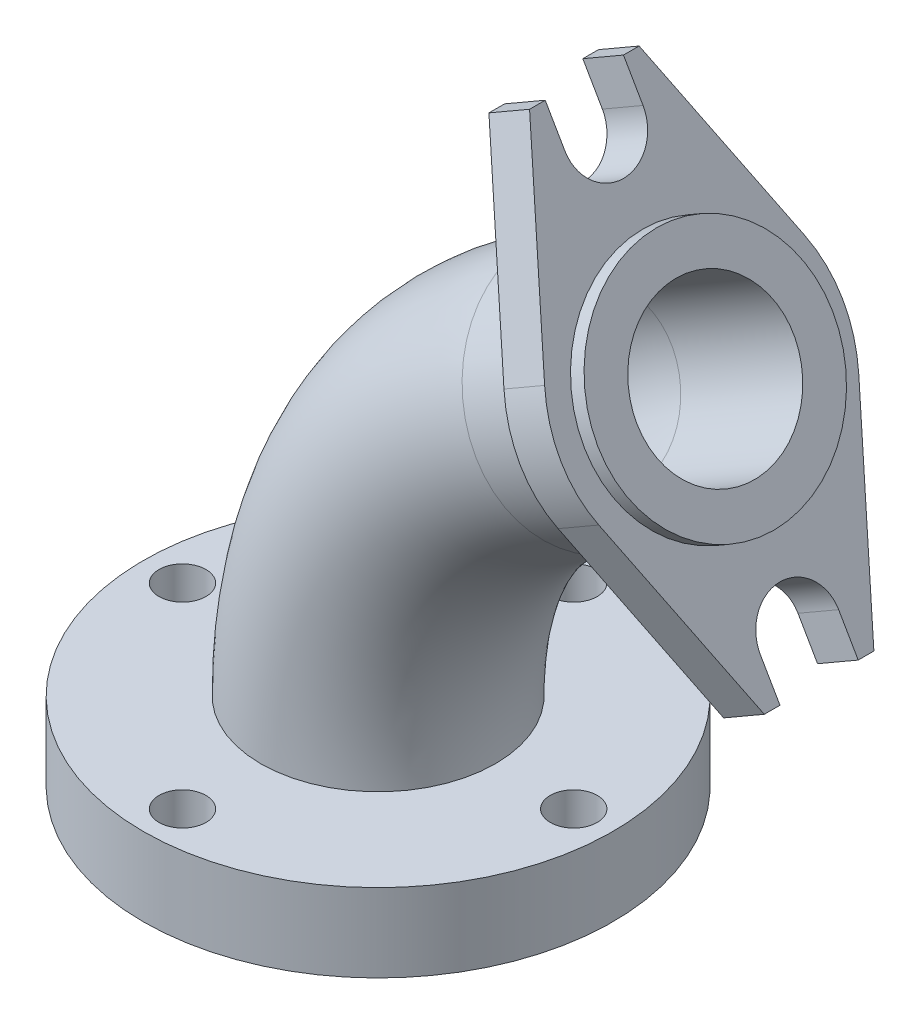
ISO-10303-21;
HEADER;
FILE_DESCRIPTION(('STEP AP214'),'2;1');
FILE_NAME('part.step','',(''),(''),'','','');
FILE_SCHEMA(('AUTOMOTIVE_DESIGN { 1 0 10303 214 1 1 1 1 }'));
ENDSEC;
DATA;
#1=APPLICATION_CONTEXT('core data for automotive mechanical design processes');
#2=APPLICATION_PROTOCOL_DEFINITION('international standard','automotive_design',2000,#1);
#3=PRODUCT_CONTEXT('',#1,'mechanical');
#4=PRODUCT('Part','Part','',(#3));
#5=PRODUCT_RELATED_PRODUCT_CATEGORY('part','',(#4));
#6=PRODUCT_DEFINITION_FORMATION('','',#4);
#7=PRODUCT_DEFINITION_CONTEXT('part definition',#1,'design');
#8=PRODUCT_DEFINITION('design','',#6,#7);
#9=PRODUCT_DEFINITION_SHAPE('','',#8);
#10=(LENGTH_UNIT() NAMED_UNIT(*) SI_UNIT(.MILLI.,.METRE.));
#11=(NAMED_UNIT(*) PLANE_ANGLE_UNIT() SI_UNIT($,.RADIAN.));
#12=(NAMED_UNIT(*) SI_UNIT($,.STERADIAN.) SOLID_ANGLE_UNIT());
#13=UNCERTAINTY_MEASURE_WITH_UNIT(LENGTH_MEASURE(1.E-05),#10,'distance_accuracy_value','');
#14=(GEOMETRIC_REPRESENTATION_CONTEXT(3) GLOBAL_UNCERTAINTY_ASSIGNED_CONTEXT((#13)) GLOBAL_UNIT_ASSIGNED_CONTEXT((#10,
#11,#12)) REPRESENTATION_CONTEXT('',''));
#15=CARTESIAN_POINT('',(0.,0.,0.));
#16=DIRECTION('',(0.,0.,1.));
#17=DIRECTION('',(1.,0.,0.));
#18=AXIS2_PLACEMENT_3D('',#15,#16,#17);
#19=CARTESIAN_POINT('',(27.4999999999998,57.631397208144,0.));
#20=DIRECTION('',(0.866025403784436,0.500000000000004,0.));
#21=DIRECTION('',(-0.500000000000004,0.866025403784436,0.));
#22=AXIS2_PLACEMENT_3D('',#19,#20,#21);
#23=CYLINDRICAL_SURFACE('',#22,15.);
#24=CARTESIAN_POINT('',(27.4999999999998,57.631397208144,0.));
#25=DIRECTION('',(0.866025403784436,0.500000000000004,0.));
#26=DIRECTION('',(0.,0.,1.));
#27=AXIS2_PLACEMENT_3D('',#24,#25,#26);
#28=CIRCLE('',#27,15.);
#29=CARTESIAN_POINT('',(19.9999999999997,70.6217782649105,0.));
#30=VERTEX_POINT('',#29);
#31=EDGE_CURVE('E306',#30,#30,#28,.T.);
#32=ORIENTED_EDGE('',*,*,#31,.T.);
#33=EDGE_LOOP('',(#32));
#34=FACE_BOUND('',#33,.T.);
#35=CARTESIAN_POINT('',(36.1602540378442,62.6313972081441,0.));
#36=DIRECTION('',(0.866025403784436,0.500000000000004,0.));
#37=DIRECTION('',(-0.500000000000005,0.866025403784436,0.));
#38=AXIS2_PLACEMENT_3D('',#35,#36,#37);
#39=CIRCLE('',#38,15.);
#40=CARTESIAN_POINT('',(28.6602540378441,75.6217782649106,0.));
#41=VERTEX_POINT('',#40);
#42=EDGE_CURVE('E263',#41,#41,#39,.F.);
#43=ORIENTED_EDGE('',*,*,#42,.T.);
#44=EDGE_LOOP('',(#43));
#45=FACE_BOUND('',#44,.T.);
#46=ADVANCED_FACE('F43',(#34,#45),#23,.T.);
#47=CARTESIAN_POINT('',(0.,10.,0.));
#48=DIRECTION('',(0.,1.,0.));
#49=DIRECTION('',(0.,0.,1.));
#50=AXIS2_PLACEMENT_3D('',#47,#48,#49);
#51=PLANE('',#50);
#52=CARTESIAN_POINT('',(0.,10.,0.));
#53=DIRECTION('',(0.,1.,0.));
#54=DIRECTION('',(0.,0.,1.));
#55=AXIS2_PLACEMENT_3D('',#52,#53,#54);
#56=CIRCLE('',#55,15.);
#57=CARTESIAN_POINT('',(-15.,10.,0.));
#58=VERTEX_POINT('',#57);
#59=EDGE_CURVE('E54',#58,#58,#56,.T.);
#60=ORIENTED_EDGE('',*,*,#59,.F.);
#61=EDGE_LOOP('',(#60));
#62=FACE_BOUND('',#61,.T.);
#63=CARTESIAN_POINT('',(-25.,10.,-1.74574066942157E-13));
#64=DIRECTION('',(0.,1.,0.));
#65=DIRECTION('',(0.,0.,1.));
#66=AXIS2_PLACEMENT_3D('',#63,#64,#65);
#67=CIRCLE('',#66,3.);
#68=CARTESIAN_POINT('',(-25.,10.,2.99999999999983));
#69=VERTEX_POINT('',#68);
#70=EDGE_CURVE('E339',#69,#69,#67,.T.);
#71=ORIENTED_EDGE('',*,*,#70,.F.);
#72=EDGE_LOOP('',(#71));
#73=FACE_BOUND('',#72,.T.);
#74=CARTESIAN_POINT('',(25.,10.,0.));
#75=DIRECTION('',(0.,1.,0.));
#76=DIRECTION('',(0.,0.,1.));
#77=AXIS2_PLACEMENT_3D('',#74,#75,#76);
#78=CIRCLE('',#77,3.);
#79=CARTESIAN_POINT('',(25.,10.,3.));
#80=VERTEX_POINT('',#79);
#81=EDGE_CURVE('E355',#80,#80,#78,.T.);
#82=ORIENTED_EDGE('',*,*,#81,.F.);
#83=EDGE_LOOP('',(#82));
#84=FACE_BOUND('',#83,.T.);
#85=CARTESIAN_POINT('',(0.,10.,0.));
#86=DIRECTION('',(0.,1.,0.));
#87=DIRECTION('',(0.,0.,1.));
#88=AXIS2_PLACEMENT_3D('',#85,#86,#87);
#89=CIRCLE('',#88,30.);
#90=CARTESIAN_POINT('',(0.,10.,30.));
#91=VERTEX_POINT('',#90);
#92=EDGE_CURVE('E327',#91,#91,#89,.T.);
#93=ORIENTED_EDGE('',*,*,#92,.T.);
#94=EDGE_LOOP('',(#93));
#95=FACE_BOUND('',#94,.T.);
#96=CARTESIAN_POINT('',(0.,10.,25.));
#97=DIRECTION('',(0.,1.,0.));
#98=DIRECTION('',(0.,0.,1.));
#99=AXIS2_PLACEMENT_3D('',#96,#97,#98);
#100=CIRCLE('',#99,3.);
#101=CARTESIAN_POINT('',(0.,10.,28.));
#102=VERTEX_POINT('',#101);
#103=EDGE_CURVE('E347',#102,#102,#100,.T.);
#104=ORIENTED_EDGE('',*,*,#103,.F.);
#105=EDGE_LOOP('',(#104));
#106=FACE_BOUND('',#105,.T.);
#107=CARTESIAN_POINT('',(2.61861100413235E-13,10.,-25.));
#108=DIRECTION('',(0.,1.,0.));
#109=DIRECTION('',(0.,0.,1.));
#110=AXIS2_PLACEMENT_3D('',#107,#108,#109);
#111=CIRCLE('',#110,3.);
#112=CARTESIAN_POINT('',(2.61861100413235E-13,10.,-22.));
#113=VERTEX_POINT('',#112);
#114=EDGE_CURVE('E331',#113,#113,#111,.T.);
#115=ORIENTED_EDGE('',*,*,#114,.F.);
#116=EDGE_LOOP('',(#115));
#117=FACE_BOUND('',#116,.T.);
#118=ADVANCED_FACE('F377',(#62,#73,#84,#95,#106,#117),#51,.T.);
#119=CARTESIAN_POINT('',(0.,0.,0.));
#120=DIRECTION('',(0.,1.,0.));
#121=DIRECTION('',(0.,0.,1.));
#122=AXIS2_PLACEMENT_3D('',#119,#120,#121);
#123=PLANE('',#122);
#124=CARTESIAN_POINT('',(0.,0.,0.));
#125=DIRECTION('',(0.,1.,0.));
#126=DIRECTION('',(0.,0.,1.));
#127=AXIS2_PLACEMENT_3D('',#124,#125,#126);
#128=CIRCLE('',#127,30.);
#129=CARTESIAN_POINT('',(0.,0.,30.));
#130=VERTEX_POINT('',#129);
#131=EDGE_CURVE('E47',#130,#130,#128,.T.);
#132=ORIENTED_EDGE('',*,*,#131,.F.);
#133=EDGE_LOOP('',(#132));
#134=FACE_BOUND('',#133,.T.);
#135=CARTESIAN_POINT('',(0.,0.,0.));
#136=DIRECTION('',(0.,1.,0.));
#137=DIRECTION('',(0.,0.,1.));
#138=AXIS2_PLACEMENT_3D('',#135,#136,#137);
#139=CIRCLE('',#138,10.);
#140=CARTESIAN_POINT('',(0.,0.,10.));
#141=VERTEX_POINT('',#140);
#142=EDGE_CURVE('E359',#141,#141,#139,.T.);
#143=ORIENTED_EDGE('',*,*,#142,.T.);
#144=EDGE_LOOP('',(#143));
#145=FACE_BOUND('',#144,.T.);
#146=CARTESIAN_POINT('',(25.,0.,0.));
#147=DIRECTION('',(0.,1.,0.));
#148=DIRECTION('',(0.,0.,1.));
#149=AXIS2_PLACEMENT_3D('',#146,#147,#148);
#150=CIRCLE('',#149,3.);
#151=CARTESIAN_POINT('',(25.,0.,3.));
#152=VERTEX_POINT('',#151);
#153=EDGE_CURVE('E351',#152,#152,#150,.T.);
#154=ORIENTED_EDGE('',*,*,#153,.T.);
#155=EDGE_LOOP('',(#154));
#156=FACE_BOUND('',#155,.T.);
#157=CARTESIAN_POINT('',(0.,0.,25.));
#158=DIRECTION('',(0.,1.,0.));
#159=DIRECTION('',(0.,0.,1.));
#160=AXIS2_PLACEMENT_3D('',#157,#158,#159);
#161=CIRCLE('',#160,3.);
#162=CARTESIAN_POINT('',(0.,0.,28.));
#163=VERTEX_POINT('',#162);
#164=EDGE_CURVE('E343',#163,#163,#161,.T.);
#165=ORIENTED_EDGE('',*,*,#164,.T.);
#166=EDGE_LOOP('',(#165));
#167=FACE_BOUND('',#166,.T.);
#168=CARTESIAN_POINT('',(-25.,0.,-1.74574066942157E-13));
#169=DIRECTION('',(0.,1.,0.));
#170=DIRECTION('',(0.,0.,1.));
#171=AXIS2_PLACEMENT_3D('',#168,#169,#170);
#172=CIRCLE('',#171,3.);
#173=CARTESIAN_POINT('',(-25.,0.,2.99999999999983));
#174=VERTEX_POINT('',#173);
#175=EDGE_CURVE('E335',#174,#174,#172,.T.);
#176=ORIENTED_EDGE('',*,*,#175,.T.);
#177=EDGE_LOOP('',(#176));
#178=FACE_BOUND('',#177,.T.);
#179=CARTESIAN_POINT('',(2.61861100413235E-13,0.,-25.));
#180=DIRECTION('',(0.,1.,0.));
#181=DIRECTION('',(0.,0.,1.));
#182=AXIS2_PLACEMENT_3D('',#179,#180,#181);
#183=CIRCLE('',#182,3.);
#184=CARTESIAN_POINT('',(2.61861100413235E-13,0.,-22.));
#185=VERTEX_POINT('',#184);
#186=EDGE_CURVE('E320',#185,#185,#183,.T.);
#187=ORIENTED_EDGE('',*,*,#186,.T.);
#188=EDGE_LOOP('',(#187));
#189=FACE_BOUND('',#188,.T.);
#190=ADVANCED_FACE('F374',(#134,#145,#156,#167,#178,#189),#123,.F.);
#191=CARTESIAN_POINT('',(0.,10.,0.));
#192=DIRECTION('',(0.,-1.,0.));
#193=DIRECTION('',(0.,0.,-1.));
#194=AXIS2_PLACEMENT_3D('',#191,#192,#193);
#195=CYLINDRICAL_SURFACE('',#194,30.);
#196=ORIENTED_EDGE('',*,*,#92,.F.);
#197=EDGE_LOOP('',(#196));
#198=FACE_BOUND('',#197,.T.);
#199=ORIENTED_EDGE('',*,*,#131,.T.);
#200=EDGE_LOOP('',(#199));
#201=FACE_BOUND('',#200,.T.);
#202=ADVANCED_FACE('F45',(#198,#201),#195,.T.);
#203=CARTESIAN_POINT('',(0.,10.,0.));
#204=DIRECTION('',(0.,-1.,0.));
#205=DIRECTION('',(0.,0.,-1.));
#206=AXIS2_PLACEMENT_3D('',#203,#204,#205);
#207=CYLINDRICAL_SURFACE('',#206,10.);
#208=CARTESIAN_POINT('',(0.,10.,0.));
#209=DIRECTION('',(0.,1.,0.));
#210=DIRECTION('',(0.,0.,1.));
#211=AXIS2_PLACEMENT_3D('',#208,#209,#210);
#212=CIRCLE('',#211,10.);
#213=CARTESIAN_POINT('',(-10.,10.,0.));
#214=VERTEX_POINT('',#213);
#215=EDGE_CURVE('E307',#214,#214,#212,.F.);
#216=ORIENTED_EDGE('',*,*,#215,.F.);
#217=EDGE_LOOP('',(#216));
#218=FACE_BOUND('',#217,.T.);
#219=ORIENTED_EDGE('',*,*,#142,.F.);
#220=EDGE_LOOP('',(#219));
#221=FACE_BOUND('',#220,.T.);
#222=ADVANCED_FACE('F568',(#218,#221),#207,.F.);
#223=CARTESIAN_POINT('',(25.,10.,0.));
#224=DIRECTION('',(0.,-1.,0.));
#225=DIRECTION('',(0.,0.,-1.));
#226=AXIS2_PLACEMENT_3D('',#223,#224,#225);
#227=CYLINDRICAL_SURFACE('',#226,3.);
#228=ORIENTED_EDGE('',*,*,#81,.T.);
#229=EDGE_LOOP('',(#228));
#230=FACE_BOUND('',#229,.T.);
#231=ORIENTED_EDGE('',*,*,#153,.F.);
#232=EDGE_LOOP('',(#231));
#233=FACE_BOUND('',#232,.T.);
#234=ADVANCED_FACE('F571',(#230,#233),#227,.F.);
#235=CARTESIAN_POINT('',(0.,10.,25.));
#236=DIRECTION('',(0.,-1.,0.));
#237=DIRECTION('',(0.,0.,-1.));
#238=AXIS2_PLACEMENT_3D('',#235,#236,#237);
#239=CYLINDRICAL_SURFACE('',#238,3.);
#240=ORIENTED_EDGE('',*,*,#103,.T.);
#241=EDGE_LOOP('',(#240));
#242=FACE_BOUND('',#241,.T.);
#243=ORIENTED_EDGE('',*,*,#164,.F.);
#244=EDGE_LOOP('',(#243));
#245=FACE_BOUND('',#244,.T.);
#246=ADVANCED_FACE('F403',(#242,#245),#239,.F.);
#247=CARTESIAN_POINT('',(-25.,10.,-1.74574066942157E-13));
#248=DIRECTION('',(0.,-1.,0.));
#249=DIRECTION('',(0.,0.,-1.));
#250=AXIS2_PLACEMENT_3D('',#247,#248,#249);
#251=CYLINDRICAL_SURFACE('',#250,3.);
#252=ORIENTED_EDGE('',*,*,#70,.T.);
#253=EDGE_LOOP('',(#252));
#254=FACE_BOUND('',#253,.T.);
#255=ORIENTED_EDGE('',*,*,#175,.F.);
#256=EDGE_LOOP('',(#255));
#257=FACE_BOUND('',#256,.T.);
#258=ADVANCED_FACE('F391',(#254,#257),#251,.F.);
#259=CARTESIAN_POINT('',(2.61861100413235E-13,10.,-25.));
#260=DIRECTION('',(0.,-1.,0.));
#261=DIRECTION('',(0.,0.,-1.));
#262=AXIS2_PLACEMENT_3D('',#259,#260,#261);
#263=CYLINDRICAL_SURFACE('',#262,3.);
#264=ORIENTED_EDGE('',*,*,#114,.T.);
#265=EDGE_LOOP('',(#264));
#266=FACE_BOUND('',#265,.T.);
#267=ORIENTED_EDGE('',*,*,#186,.F.);
#268=EDGE_LOOP('',(#267));
#269=FACE_BOUND('',#268,.T.);
#270=ADVANCED_FACE('F388',(#266,#269),#263,.F.);
#271=CARTESIAN_POINT('',(55.,10.,0.));
#272=DIRECTION('',(0.,0.,-1.));
#273=DIRECTION('',(-1.,0.,0.));
#274=AXIS2_PLACEMENT_3D('',#271,#272,#273);
#275=TOROIDAL_SURFACE('',#274,55.,15.);
#276=CARTESIAN_POINT('',(55.,10.,0.));
#277=DIRECTION('',(0.,0.,-1.));
#278=DIRECTION('',(-1.,0.,0.));
#279=AXIS2_PLACEMENT_3D('',#276,#277,#278);
#280=CIRCLE('',#279,70.);
#281=EDGE_CURVE('',#58,#30,#280,.T.);
#282=ORIENTED_EDGE('',*,*,#59,.T.);
#283=ORIENTED_EDGE('',*,*,#31,.F.);
#284=ORIENTED_EDGE('',*,*,#281,.T.);
#285=ORIENTED_EDGE('',*,*,#281,.F.);
#286=EDGE_LOOP('',(#282,#284,#283,#285));
#287=FACE_BOUND('',#286,.T.);
#288=ADVANCED_FACE('F390',(#287),#275,.T.);
#289=CARTESIAN_POINT('',(41.3564064605508,65.6313972081441,0.));
#290=DIRECTION('',(0.866025403784436,0.500000000000004,0.));
#291=DIRECTION('',(-0.500000000000005,0.866025403784436,0.));
#292=AXIS2_PLACEMENT_3D('',#289,#290,#291);
#293=CIRCLE('',#292,15.);
#294=CARTESIAN_POINT('',(33.8564064605507,78.6217782649106,0.));
#295=VERTEX_POINT('',#294);
#296=EDGE_CURVE('E11',#295,#295,#293,.F.);
#297=CARTESIAN_POINT('',(43.0884572681196,66.6313972081441,0.));
#298=DIRECTION('',(0.866025403784436,0.500000000000004,0.));
#299=DIRECTION('',(0.,0.,1.));
#300=AXIS2_PLACEMENT_3D('',#297,#298,#299);
#301=CIRCLE('',#300,15.);
#302=CARTESIAN_POINT('',(35.5884572681195,79.6217782649106,0.));
#303=VERTEX_POINT('',#302);
#304=EDGE_CURVE('E312',#303,#303,#301,.T.);
#305=CARTESIAN_POINT('',(33.8564064605507,78.6217782649106,0.));
#306=CARTESIAN_POINT('',(33.8744486564629,78.6321949315773,0.));
#307=CARTESIAN_POINT('',(33.8924908523751,78.642611598244,0.));
#308=CARTESIAN_POINT('',(33.9285752441994,78.6634449315773,0.));
#309=CARTESIAN_POINT('',(33.9466174401116,78.6738615982439,0.));
#310=CARTESIAN_POINT('',(33.9827018319359,78.6946949315773,0.));
#311=CARTESIAN_POINT('',(34.0007440278481,78.705111598244,0.));
#312=CARTESIAN_POINT('',(34.0368284196725,78.7259449315773,0.));
#313=CARTESIAN_POINT('',(34.0548706155846,78.736361598244,0.));
#314=CARTESIAN_POINT('',(34.090955007409,78.7571949315773,0.));
#315=CARTESIAN_POINT('',(34.1089972033212,78.767611598244,0.));
#316=CARTESIAN_POINT('',(34.1450815951455,78.7884449315773,0.));
#317=CARTESIAN_POINT('',(34.1631237910577,78.7988615982439,0.));
#318=CARTESIAN_POINT('',(34.199208182882,78.8196949315773,0.));
#319=CARTESIAN_POINT('',(34.2172503787942,78.8301115982439,0.));
#320=CARTESIAN_POINT('',(34.2533347706186,78.8509449315773,0.));
#321=CARTESIAN_POINT('',(34.2713769665307,78.861361598244,0.));
#322=CARTESIAN_POINT('',(34.3074613583551,78.8821949315773,0.));
#323=CARTESIAN_POINT('',(34.3255035542673,78.892611598244,0.));
#324=CARTESIAN_POINT('',(34.3615879460916,78.9134449315773,0.));
#325=CARTESIAN_POINT('',(34.3796301420038,78.9238615982439,0.));
#326=CARTESIAN_POINT('',(34.4157145338281,78.9446949315773,0.));
#327=CARTESIAN_POINT('',(34.4337567297403,78.9551115982439,0.));
#328=CARTESIAN_POINT('',(34.4698411215647,78.9759449315773,0.));
#329=CARTESIAN_POINT('',(34.4878833174769,78.9863615982439,0.));
#330=CARTESIAN_POINT('',(34.5239677093012,79.0071949315773,0.));
#331=CARTESIAN_POINT('',(34.5420099052134,79.017611598244,0.));
#332=CARTESIAN_POINT('',(34.5780942970377,79.0384449315773,0.));
#333=CARTESIAN_POINT('',(34.5961364929499,79.0488615982439,0.));
#334=CARTESIAN_POINT('',(34.6322208847742,79.0696949315773,0.));
#335=CARTESIAN_POINT('',(34.6502630806864,79.0801115982439,0.));
#336=CARTESIAN_POINT('',(34.6863474725108,79.1009449315773,0.));
#337=CARTESIAN_POINT('',(34.7043896684229,79.1113615982439,0.));
#338=CARTESIAN_POINT('',(34.7404740602473,79.1321949315773,0.));
#339=CARTESIAN_POINT('',(34.7585162561595,79.1426115982439,0.));
#340=CARTESIAN_POINT('',(34.7946006479838,79.1634449315773,0.));
#341=CARTESIAN_POINT('',(34.812642843896,79.1738615982439,0.));
#342=CARTESIAN_POINT('',(34.8487272357203,79.1946949315773,0.));
#343=CARTESIAN_POINT('',(34.8667694316325,79.2051115982439,0.));
#344=CARTESIAN_POINT('',(34.9028538234569,79.2259449315773,0.));
#345=CARTESIAN_POINT('',(34.920896019369,79.2363615982439,0.));
#346=CARTESIAN_POINT('',(34.9569804111934,79.2571949315773,0.));
#347=CARTESIAN_POINT('',(34.9750226071056,79.2676115982439,0.));
#348=CARTESIAN_POINT('',(35.0111069989299,79.2884449315773,0.));
#349=CARTESIAN_POINT('',(35.0291491948421,79.2988615982439,0.));
#350=CARTESIAN_POINT('',(35.0652335866665,79.3196949315773,0.));
#351=CARTESIAN_POINT('',(35.0832757825786,79.3301115982439,0.));
#352=CARTESIAN_POINT('',(35.119360174403,79.3509449315773,0.));
#353=CARTESIAN_POINT('',(35.1374023703152,79.3613615982439,0.));
#354=CARTESIAN_POINT('',(35.1734867621395,79.3821949315773,0.));
#355=CARTESIAN_POINT('',(35.1915289580517,79.3926115982439,0.));
#356=CARTESIAN_POINT('',(35.227613349876,79.4134449315773,0.));
#357=CARTESIAN_POINT('',(35.2456555457882,79.423861598244,0.));
#358=CARTESIAN_POINT('',(35.2817399376126,79.4446949315773,0.));
#359=CARTESIAN_POINT('',(35.2997821335247,79.4551115982439,0.));
#360=CARTESIAN_POINT('',(35.3358665253491,79.4759449315773,0.));
#361=CARTESIAN_POINT('',(35.3539087212613,79.4863615982439,0.));
#362=CARTESIAN_POINT('',(35.3899931130856,79.5071949315773,0.));
#363=CARTESIAN_POINT('',(35.4080353089978,79.5176115982439,0.));
#364=CARTESIAN_POINT('',(35.4441197008221,79.5384449315773,0.));
#365=CARTESIAN_POINT('',(35.4621618967343,79.5488615982439,0.));
#366=CARTESIAN_POINT('',(35.4982462885587,79.5696949315773,0.));
#367=CARTESIAN_POINT('',(35.5162884844708,79.5801115982439,0.));
#368=CARTESIAN_POINT('',(35.5523728762952,79.6009449315773,0.));
#369=CARTESIAN_POINT('',(35.5704150722074,79.6113615982439,0.));
#370=CARTESIAN_POINT('',(35.5884572681195,79.6217782649106,0.));
#371=B_SPLINE_CURVE_WITH_KNOTS('',3,(#305,#306,#307,#308,#309,#310,#311,#312,#313,#314,#315,
#316,#317,#318,#319,#320,#321,#322,#323,#324,#325,#326,#327,#328,#329,#330,#331,#332,#333,#334,
#335,#336,#337,#338,#339,#340,#341,#342,#343,#344,#345,#346,#347,#348,#349,#350,#351,#352,#353,
#354,#355,#356,#357,#358,#359,#360,#361,#362,#363,#364,#365,#366,#367,#368,#369,#370),
.UNSPECIFIED.,.F.,.F.,(4,2,2,2,2,2,2,2,2,2,2,2,2,2,2,2,2,2,2,2,2,2,2,2,2,2,2,2,2,2,2,2,4),(0.,
0.0624999999999985,0.124999999999991,0.187499999999996,0.249999999999995,0.312499999999993,
0.374999999999986,0.437499999999984,0.49999999999999,0.562499999999988,0.624999999999981,
0.687499999999979,0.749999999999978,0.812499999999983,0.874999999999982,0.937499999999974,
0.999999999999973,1.06249999999997,1.12499999999997,1.18749999999997,1.24999999999997,
1.31249999999997,1.37499999999996,1.43749999999996,1.49999999999996,1.56249999999996,
1.62499999999997,1.68749999999996,1.74999999999996,1.81249999999996,1.87499999999996,
1.93749999999995,1.99999999999995),.UNSPECIFIED.);
#372=EDGE_CURVE('BSEAM399',#295,#303,#371,.T.);
#373=ORIENTED_EDGE('',*,*,#296,.F.);
#374=ORIENTED_EDGE('',*,*,#304,.F.);
#375=ORIENTED_EDGE('',*,*,#372,.T.);
#376=ORIENTED_EDGE('',*,*,#372,.F.);
#377=EDGE_LOOP('',(#373,#375,#374,#376));
#378=FACE_BOUND('',#377,.T.);
#379=ADVANCED_FACE('F399',(#378),#23,.T.);
#380=CARTESIAN_POINT('',(43.0884572681196,66.6313972081441,0.));
#381=DIRECTION('',(0.866025403784436,0.500000000000004,0.));
#382=DIRECTION('',(0.,0.,1.));
#383=AXIS2_PLACEMENT_3D('',#380,#381,#382);
#384=PLANE('',#383);
#385=CARTESIAN_POINT('',(43.0884572681196,66.6313972081441,0.));
#386=DIRECTION('',(0.866025403784436,0.500000000000004,0.));
#387=DIRECTION('',(0.,0.,1.));
#388=AXIS2_PLACEMENT_3D('',#385,#386,#387);
#389=CIRCLE('',#388,10.);
#390=CARTESIAN_POINT('',(43.0884572681196,66.6313972081441,10.));
#391=VERTEX_POINT('',#390);
#392=EDGE_CURVE('E316',#391,#391,#389,.F.);
#393=ORIENTED_EDGE('',*,*,#392,.T.);
#394=EDGE_LOOP('',(#393));
#395=FACE_BOUND('',#394,.T.);
#396=ORIENTED_EDGE('',*,*,#304,.T.);
#397=EDGE_LOOP('',(#396));
#398=FACE_BOUND('',#397,.T.);
#399=ADVANCED_FACE('F420',(#395,#398),#384,.T.);
#400=CARTESIAN_POINT('',(55.,10.,0.));
#401=DIRECTION('',(0.,0.,-1.));
#402=DIRECTION('',(-1.,0.,0.));
#403=AXIS2_PLACEMENT_3D('',#400,#401,#402);
#404=TOROIDAL_SURFACE('',#403,55.,10.);
#405=CARTESIAN_POINT('',(27.4999999999998,57.631397208144,0.));
#406=DIRECTION('',(0.866025403784436,0.500000000000004,0.));
#407=DIRECTION('',(0.,0.,1.));
#408=AXIS2_PLACEMENT_3D('',#405,#406,#407);
#409=CIRCLE('',#408,10.);
#410=CARTESIAN_POINT('',(22.4999999999997,66.2916512459884,0.));
#411=VERTEX_POINT('',#410);
#412=EDGE_CURVE('E311',#411,#411,#409,.F.);
#413=CARTESIAN_POINT('',(55.,10.,0.));
#414=DIRECTION('',(0.,0.,-1.));
#415=DIRECTION('',(-1.,0.,0.));
#416=AXIS2_PLACEMENT_3D('',#413,#414,#415);
#417=CIRCLE('',#416,65.);
#418=EDGE_CURVE('',#214,#411,#417,.T.);
#419=ORIENTED_EDGE('',*,*,#215,.T.);
#420=ORIENTED_EDGE('',*,*,#412,.F.);
#421=ORIENTED_EDGE('',*,*,#418,.T.);
#422=ORIENTED_EDGE('',*,*,#418,.F.);
#423=EDGE_LOOP('',(#419,#421,#420,#422));
#424=FACE_BOUND('',#423,.T.);
#425=ADVANCED_FACE('F408',(#424),#404,.F.);
#426=CARTESIAN_POINT('',(27.4999999999998,57.631397208144,0.));
#427=DIRECTION('',(0.866025403784436,0.500000000000004,0.));
#428=DIRECTION('',(-0.500000000000004,0.866025403784436,0.));
#429=AXIS2_PLACEMENT_3D('',#426,#427,#428);
#430=CYLINDRICAL_SURFACE('',#429,10.);
#431=ORIENTED_EDGE('',*,*,#392,.F.);
#432=EDGE_LOOP('',(#431));
#433=FACE_BOUND('',#432,.T.);
#434=ORIENTED_EDGE('',*,*,#412,.T.);
#435=EDGE_LOOP('',(#434));
#436=FACE_BOUND('',#435,.T.);
#437=ADVANCED_FACE('F394',(#433,#436),#430,.F.);
#438=CARTESIAN_POINT('',(36.1602540378441,62.6313972081441,0.));
#439=DIRECTION('',(0.866025403784436,0.500000000000004,0.));
#440=DIRECTION('',(-0.500000000000004,0.866025403784436,0.));
#441=AXIS2_PLACEMENT_3D('',#438,#439,#440);
#442=CYLINDRICAL_SURFACE('',#441,18.);
#443=CARTESIAN_POINT('',(41.3564064605508,65.6313972081441,0.));
#444=DIRECTION('',(0.866025403784436,0.500000000000004,0.));
#445=DIRECTION('',(-0.500000000000005,0.866025403784436,0.));
#446=AXIS2_PLACEMENT_3D('',#443,#444,#445);
#447=CIRCLE('',#446,18.);
#448=CARTESIAN_POINT('',(37.8948679990123,71.6269576958825,16.6153846153846));
#449=VERTEX_POINT('',#448);
#450=CARTESIAN_POINT('',(44.8179449220893,59.6358367204057,16.6153846153846));
#451=VERTEX_POINT('',#450);
#452=EDGE_CURVE('E199',#449,#451,#447,.T.);
#453=ORIENTED_EDGE('',*,*,#452,.F.);
#454=DIRECTION('',(0.866025403784436,0.500000000000004,0.));
#455=VECTOR('',#454,1.);
#456=CARTESIAN_POINT('',(32.6987155763056,68.6269576958825,16.6153846153846));
#457=LINE('',#456,#455);
#458=CARTESIAN_POINT('',(32.6987155763056,68.6269576958825,16.6153846153846));
#459=VERTEX_POINT('',#458);
#460=EDGE_CURVE('E63',#459,#449,#457,.T.);
#461=ORIENTED_EDGE('',*,*,#460,.F.);
#462=CARTESIAN_POINT('',(36.1602540378441,62.6313972081441,0.));
#463=DIRECTION('',(0.866025403784436,0.500000000000004,0.));
#464=DIRECTION('',(-0.500000000000005,0.866025403784436,0.));
#465=AXIS2_PLACEMENT_3D('',#462,#463,#464);
#466=CIRCLE('',#465,18.);
#467=CARTESIAN_POINT('',(39.6217924993827,56.6358367204057,16.6153846153846));
#468=VERTEX_POINT('',#467);
#469=EDGE_CURVE('E260',#459,#468,#466,.T.);
#470=ORIENTED_EDGE('',*,*,#469,.T.);
#471=DIRECTION('',(0.866025403784436,0.500000000000004,0.));
#472=VECTOR('',#471,1.);
#473=CARTESIAN_POINT('',(39.6217924993827,56.6358367204057,16.6153846153846));
#474=LINE('',#473,#472);
#475=EDGE_CURVE('E128',#468,#451,#474,.T.);
#476=ORIENTED_EDGE('',*,*,#475,.T.);
#477=EDGE_LOOP('',(#453,#461,#470,#476));
#478=FACE_BOUND('',#477,.T.);
#479=ADVANCED_FACE('F402',(#478),#442,.T.);
#480=CARTESIAN_POINT('',(21.160254037844,88.6121593216772,7.));
#481=DIRECTION('',(-0.192307692307694,0.333086693763245,0.923076923076923));
#482=DIRECTION('',(0.,-0.940634162003545,0.339422116651065));
#483=AXIS2_PLACEMENT_3D('',#480,#481,#482);
#484=PLANE('',#483);
#485=DIRECTION('',(0.461538461538465,-0.799408065031787,0.384615384615385));
#486=VECTOR('',#485,1.);
#487=CARTESIAN_POINT('',(26.3564064605506,91.6121593216772,7.));
#488=LINE('',#487,#486);
#489=CARTESIAN_POINT('',(26.3564064605506,91.6121593216772,7.));
#490=VERTEX_POINT('',#489);
#491=EDGE_CURVE('E256',#490,#449,#488,.T.);
#492=ORIENTED_EDGE('',*,*,#491,.F.);
#493=DIRECTION('',(0.866025403784436,0.500000000000004,0.));
#494=VECTOR('',#493,1.);
#495=CARTESIAN_POINT('',(21.160254037844,88.6121593216772,7.));
#496=LINE('',#495,#494);
#497=CARTESIAN_POINT('',(21.160254037844,88.6121593216772,7.));
#498=VERTEX_POINT('',#497);
#499=EDGE_CURVE('E116',#498,#490,#496,.T.);
#500=ORIENTED_EDGE('',*,*,#499,.F.);
#501=DIRECTION('',(0.461538461538465,-0.799408065031787,0.384615384615385));
#502=VECTOR('',#501,1.);
#503=CARTESIAN_POINT('',(21.160254037844,88.6121593216772,7.));
#504=LINE('',#503,#502);
#505=EDGE_CURVE('E185',#498,#459,#504,.T.);
#506=ORIENTED_EDGE('',*,*,#505,.T.);
#507=ORIENTED_EDGE('',*,*,#460,.T.);
#508=EDGE_LOOP('',(#492,#500,#506,#507));
#509=FACE_BOUND('',#508,.T.);
#510=ADVANCED_FACE('F523',(#509),#484,.T.);
#511=CARTESIAN_POINT('',(21.160254037844,88.6121593216772,5.));
#512=DIRECTION('',(-0.500000000000004,0.866025403784436,0.));
#513=DIRECTION('',(-0.866025403784436,-0.500000000000004,0.));
#514=AXIS2_PLACEMENT_3D('',#511,#512,#513);
#515=PLANE('',#514);
#516=DIRECTION('',(0.,0.,1.));
#517=VECTOR('',#516,1.);
#518=CARTESIAN_POINT('',(26.3564064605506,91.6121593216772,5.));
#519=LINE('',#518,#517);
#520=CARTESIAN_POINT('',(26.3564064605506,91.6121593216772,5.));
#521=VERTEX_POINT('',#520);
#522=EDGE_CURVE('E171',#521,#490,#519,.T.);
#523=ORIENTED_EDGE('',*,*,#522,.F.);
#524=DIRECTION('',(0.866025403784436,0.500000000000004,0.));
#525=VECTOR('',#524,1.);
#526=CARTESIAN_POINT('',(21.160254037844,88.6121593216772,5.));
#527=LINE('',#526,#525);
#528=CARTESIAN_POINT('',(21.160254037844,88.6121593216772,5.));
#529=VERTEX_POINT('',#528);
#530=EDGE_CURVE('E166',#529,#521,#527,.T.);
#531=ORIENTED_EDGE('',*,*,#530,.F.);
#532=DIRECTION('',(0.,0.,1.));
#533=VECTOR('',#532,1.);
#534=CARTESIAN_POINT('',(21.160254037844,88.6121593216772,5.));
#535=LINE('',#534,#533);
#536=EDGE_CURVE('E169',#529,#498,#535,.T.);
#537=ORIENTED_EDGE('',*,*,#536,.T.);
#538=ORIENTED_EDGE('',*,*,#499,.T.);
#539=EDGE_LOOP('',(#523,#531,#537,#538));
#540=FACE_BOUND('',#539,.T.);
#541=ADVANCED_FACE('F168',(#540),#515,.T.);
#542=CARTESIAN_POINT('',(23.660254037844,84.282032302755,5.));
#543=DIRECTION('',(0.,0.,-1.));
#544=DIRECTION('',(-1.,0.,0.));
#545=AXIS2_PLACEMENT_3D('',#542,#543,#544);
#546=PLANE('',#545);
#547=DIRECTION('',(-0.500000000000005,0.866025403784436,0.));
#548=VECTOR('',#547,1.);
#549=CARTESIAN_POINT('',(28.8564064605507,87.282032302755,5.));
#550=LINE('',#549,#548);
#551=CARTESIAN_POINT('',(28.8564064605507,87.282032302755,5.));
#552=VERTEX_POINT('',#551);
#553=EDGE_CURVE('E251',#552,#521,#550,.T.);
#554=ORIENTED_EDGE('',*,*,#553,.F.);
#555=DIRECTION('',(0.866025403784436,0.500000000000004,0.));
#556=VECTOR('',#555,1.);
#557=CARTESIAN_POINT('',(23.660254037844,84.282032302755,5.));
#558=LINE('',#557,#556);
#559=CARTESIAN_POINT('',(23.660254037844,84.282032302755,5.));
#560=VERTEX_POINT('',#559);
#561=EDGE_CURVE('E177',#560,#552,#558,.T.);
#562=ORIENTED_EDGE('',*,*,#561,.F.);
#563=DIRECTION('',(-0.500000000000005,0.866025403784436,0.));
#564=VECTOR('',#563,1.);
#565=CARTESIAN_POINT('',(23.660254037844,84.282032302755,5.));
#566=LINE('',#565,#564);
#567=EDGE_CURVE('E183',#560,#529,#566,.T.);
#568=ORIENTED_EDGE('',*,*,#567,.T.);
#569=ORIENTED_EDGE('',*,*,#530,.T.);
#570=EDGE_LOOP('',(#554,#562,#568,#569));
#571=FACE_BOUND('',#570,.T.);
#572=ADVANCED_FACE('F188',(#571),#546,.T.);
#573=CARTESIAN_POINT('',(23.660254037844,84.282032302755,0.));
#574=DIRECTION('',(0.866025403784436,0.500000000000004,0.));
#575=DIRECTION('',(-0.500000000000004,0.866025403784436,0.));
#576=AXIS2_PLACEMENT_3D('',#573,#574,#575);
#577=CYLINDRICAL_SURFACE('',#576,5.);
#578=CARTESIAN_POINT('',(28.8564064605507,87.282032302755,0.));
#579=DIRECTION('',(-0.866025403784436,-0.500000000000004,0.));
#580=DIRECTION('',(-0.500000000000005,0.866025403784436,0.));
#581=AXIS2_PLACEMENT_3D('',#578,#579,#580);
#582=CIRCLE('',#581,5.);
#583=CARTESIAN_POINT('',(28.8564064605507,87.282032302755,-5.));
#584=VERTEX_POINT('',#583);
#585=EDGE_CURVE('E247',#584,#552,#582,.T.);
#586=ORIENTED_EDGE('',*,*,#585,.F.);
#587=DIRECTION('',(0.866025403784436,0.500000000000004,0.));
#588=VECTOR('',#587,1.);
#589=CARTESIAN_POINT('',(23.660254037844,84.282032302755,-5.));
#590=LINE('',#589,#588);
#591=CARTESIAN_POINT('',(23.660254037844,84.282032302755,-5.));
#592=VERTEX_POINT('',#591);
#593=EDGE_CURVE('E268',#592,#584,#590,.T.);
#594=ORIENTED_EDGE('',*,*,#593,.F.);
#595=CARTESIAN_POINT('',(23.660254037844,84.282032302755,0.));
#596=DIRECTION('',(-0.866025403784436,-0.500000000000004,0.));
#597=DIRECTION('',(-0.500000000000005,0.866025403784436,0.));
#598=AXIS2_PLACEMENT_3D('',#595,#596,#597);
#599=CIRCLE('',#598,5.);
#600=EDGE_CURVE('E190',#592,#560,#599,.T.);
#601=ORIENTED_EDGE('',*,*,#600,.T.);
#602=ORIENTED_EDGE('',*,*,#561,.T.);
#603=EDGE_LOOP('',(#586,#594,#601,#602));
#604=FACE_BOUND('',#603,.T.);
#605=ADVANCED_FACE('F496',(#604),#577,.F.);
#606=CARTESIAN_POINT('',(23.660254037844,84.282032302755,-5.));
#607=DIRECTION('',(0.,0.,1.));
#608=DIRECTION('',(1.,0.,0.));
#609=AXIS2_PLACEMENT_3D('',#606,#607,#608);
#610=PLANE('',#609);
#611=DIRECTION('',(0.500000000000005,-0.866025403784436,0.));
#612=VECTOR('',#611,1.);
#613=CARTESIAN_POINT('',(28.8564064605507,87.282032302755,-5.));
#614=LINE('',#613,#612);
#615=CARTESIAN_POINT('',(26.3564064605506,91.6121593216772,-5.));
#616=VERTEX_POINT('',#615);
#617=EDGE_CURVE('E243',#616,#584,#614,.T.);
#618=ORIENTED_EDGE('',*,*,#617,.F.);
#619=DIRECTION('',(0.866025403784436,0.500000000000004,0.));
#620=VECTOR('',#619,1.);
#621=CARTESIAN_POINT('',(21.160254037844,88.6121593216772,-5.));
#622=LINE('',#621,#620);
#623=CARTESIAN_POINT('',(21.160254037844,88.6121593216772,-5.));
#624=VERTEX_POINT('',#623);
#625=EDGE_CURVE('E271',#624,#616,#622,.T.);
#626=ORIENTED_EDGE('',*,*,#625,.F.);
#627=DIRECTION('',(0.500000000000005,-0.866025403784436,0.));
#628=VECTOR('',#627,1.);
#629=CARTESIAN_POINT('',(23.660254037844,84.282032302755,-5.));
#630=LINE('',#629,#628);
#631=EDGE_CURVE('E193',#624,#592,#630,.T.);
#632=ORIENTED_EDGE('',*,*,#631,.T.);
#633=ORIENTED_EDGE('',*,*,#593,.T.);
#634=EDGE_LOOP('',(#618,#626,#632,#633));
#635=FACE_BOUND('',#634,.T.);
#636=ADVANCED_FACE('F493',(#635),#610,.T.);
#637=CARTESIAN_POINT('',(21.160254037844,88.6121593216772,-7.));
#638=DIRECTION('',(-0.500000000000004,0.866025403784436,0.));
#639=DIRECTION('',(-0.866025403784436,-0.500000000000004,0.));
#640=AXIS2_PLACEMENT_3D('',#637,#638,#639);
#641=PLANE('',#640);
#642=DIRECTION('',(0.,0.,1.));
#643=VECTOR('',#642,1.);
#644=CARTESIAN_POINT('',(26.3564064605506,91.6121593216772,-7.));
#645=LINE('',#644,#643);
#646=CARTESIAN_POINT('',(26.3564064605506,91.6121593216772,-7.));
#647=VERTEX_POINT('',#646);
#648=EDGE_CURVE('E239',#647,#616,#645,.T.);
#649=ORIENTED_EDGE('',*,*,#648,.F.);
#650=DIRECTION('',(0.866025403784436,0.500000000000004,0.));
#651=VECTOR('',#650,1.);
#652=CARTESIAN_POINT('',(21.160254037844,88.6121593216772,-7.));
#653=LINE('',#652,#651);
#654=CARTESIAN_POINT('',(21.160254037844,88.6121593216772,-7.));
#655=VERTEX_POINT('',#654);
#656=EDGE_CURVE('E274',#655,#647,#653,.T.);
#657=ORIENTED_EDGE('',*,*,#656,.F.);
#658=DIRECTION('',(0.,0.,1.));
#659=VECTOR('',#658,1.);
#660=CARTESIAN_POINT('',(21.160254037844,88.6121593216772,-7.));
#661=LINE('',#660,#659);
#662=EDGE_CURVE('E489',#655,#624,#661,.T.);
#663=ORIENTED_EDGE('',*,*,#662,.T.);
#664=ORIENTED_EDGE('',*,*,#625,.T.);
#665=EDGE_LOOP('',(#649,#657,#663,#664));
#666=FACE_BOUND('',#665,.T.);
#667=ADVANCED_FACE('F487',(#666),#641,.T.);
#668=CARTESIAN_POINT('',(32.6987155763056,68.6269576958825,-16.6153846153846));
#669=DIRECTION('',(-0.192307692307694,0.333086693763245,-0.923076923076923));
#670=DIRECTION('',(0.,0.940634162003545,0.339422116651065));
#671=AXIS2_PLACEMENT_3D('',#668,#669,#670);
#672=PLANE('',#671);
#673=DIRECTION('',(-0.461538461538465,0.799408065031787,0.384615384615385));
#674=VECTOR('',#673,1.);
#675=CARTESIAN_POINT('',(37.8948679990123,71.6269576958825,-16.6153846153846));
#676=LINE('',#675,#674);
#677=CARTESIAN_POINT('',(37.8948679990123,71.6269576958825,-16.6153846153846));
#678=VERTEX_POINT('',#677);
#679=EDGE_CURVE('E235',#678,#647,#676,.T.);
#680=ORIENTED_EDGE('',*,*,#679,.F.);
#681=DIRECTION('',(0.866025403784436,0.500000000000004,0.));
#682=VECTOR('',#681,1.);
#683=CARTESIAN_POINT('',(32.6987155763056,68.6269576958825,-16.6153846153846));
#684=LINE('',#683,#682);
#685=CARTESIAN_POINT('',(32.6987155763056,68.6269576958825,-16.6153846153846));
#686=VERTEX_POINT('',#685);
#687=EDGE_CURVE('E277',#686,#678,#684,.T.);
#688=ORIENTED_EDGE('',*,*,#687,.F.);
#689=DIRECTION('',(-0.461538461538465,0.799408065031787,0.384615384615385));
#690=VECTOR('',#689,1.);
#691=CARTESIAN_POINT('',(32.6987155763056,68.6269576958825,-16.6153846153846));
#692=LINE('',#691,#690);
#693=EDGE_CURVE('E483',#686,#655,#692,.T.);
#694=ORIENTED_EDGE('',*,*,#693,.T.);
#695=ORIENTED_EDGE('',*,*,#656,.T.);
#696=EDGE_LOOP('',(#680,#688,#694,#695));
#697=FACE_BOUND('',#696,.T.);
#698=ADVANCED_FACE('F480',(#697),#672,.T.);
#699=CARTESIAN_POINT('',(36.1602540378441,62.6313972081441,0.));
#700=DIRECTION('',(0.866025403784436,0.500000000000004,0.));
#701=DIRECTION('',(-0.500000000000004,0.866025403784436,0.));
#702=AXIS2_PLACEMENT_3D('',#699,#700,#701);
#703=CYLINDRICAL_SURFACE('',#702,18.);
#704=CARTESIAN_POINT('',(41.3564064605508,65.6313972081441,0.));
#705=DIRECTION('',(0.866025403784436,0.500000000000004,0.));
#706=DIRECTION('',(-0.500000000000005,0.866025403784436,0.));
#707=AXIS2_PLACEMENT_3D('',#704,#705,#706);
#708=CIRCLE('',#707,18.);
#709=CARTESIAN_POINT('',(44.8179449220893,59.6358367204057,-16.6153846153846));
#710=VERTEX_POINT('',#709);
#711=EDGE_CURVE('E231',#710,#678,#708,.T.);
#712=ORIENTED_EDGE('',*,*,#711,.F.);
#713=DIRECTION('',(0.866025403784436,0.500000000000004,0.));
#714=VECTOR('',#713,1.);
#715=CARTESIAN_POINT('',(39.6217924993827,56.6358367204057,-16.6153846153846));
#716=LINE('',#715,#714);
#717=CARTESIAN_POINT('',(39.6217924993827,56.6358367204057,-16.6153846153846));
#718=VERTEX_POINT('',#717);
#719=EDGE_CURVE('E280',#718,#710,#716,.T.);
#720=ORIENTED_EDGE('',*,*,#719,.F.);
#721=CARTESIAN_POINT('',(36.1602540378441,62.6313972081441,0.));
#722=DIRECTION('',(0.866025403784436,0.500000000000004,0.));
#723=DIRECTION('',(-0.500000000000005,0.866025403784436,0.));
#724=AXIS2_PLACEMENT_3D('',#721,#722,#723);
#725=CIRCLE('',#724,18.);
#726=EDGE_CURVE('E503',#718,#686,#725,.T.);
#727=ORIENTED_EDGE('',*,*,#726,.T.);
#728=ORIENTED_EDGE('',*,*,#687,.T.);
#729=EDGE_LOOP('',(#712,#720,#727,#728));
#730=FACE_BOUND('',#729,.T.);
#731=ADVANCED_FACE('F476',(#730),#703,.T.);
#732=CARTESIAN_POINT('',(51.1602540378443,36.650635094611,-7.));
#733=DIRECTION('',(0.192307692307694,-0.333086693763245,-0.923076923076923));
#734=DIRECTION('',(0.,0.940634162003545,-0.339422116651065));
#735=AXIS2_PLACEMENT_3D('',#732,#733,#734);
#736=PLANE('',#735);
#737=DIRECTION('',(-0.461538461538466,0.799408065031787,-0.384615384615385));
#738=VECTOR('',#737,1.);
#739=CARTESIAN_POINT('',(56.3564064605509,39.650635094611,-7.));
#740=LINE('',#739,#738);
#741=CARTESIAN_POINT('',(56.3564064605509,39.650635094611,-7.));
#742=VERTEX_POINT('',#741);
#743=EDGE_CURVE('E227',#742,#710,#740,.T.);
#744=ORIENTED_EDGE('',*,*,#743,.F.);
#745=DIRECTION('',(0.866025403784436,0.500000000000004,0.));
#746=VECTOR('',#745,1.);
#747=CARTESIAN_POINT('',(51.1602540378443,36.650635094611,-7.));
#748=LINE('',#747,#746);
#749=CARTESIAN_POINT('',(51.1602540378443,36.650635094611,-7.));
#750=VERTEX_POINT('',#749);
#751=EDGE_CURVE('E283',#750,#742,#748,.T.);
#752=ORIENTED_EDGE('',*,*,#751,.F.);
#753=DIRECTION('',(-0.461538461538466,0.799408065031787,-0.384615384615385));
#754=VECTOR('',#753,1.);
#755=CARTESIAN_POINT('',(51.1602540378443,36.650635094611,-7.));
#756=LINE('',#755,#754);
#757=EDGE_CURVE('E472',#750,#718,#756,.T.);
#758=ORIENTED_EDGE('',*,*,#757,.T.);
#759=ORIENTED_EDGE('',*,*,#719,.T.);
#760=EDGE_LOOP('',(#744,#752,#758,#759));
#761=FACE_BOUND('',#760,.T.);
#762=ADVANCED_FACE('F470',(#761),#736,.T.);
#763=CARTESIAN_POINT('',(51.1602540378443,36.650635094611,-5.));
#764=DIRECTION('',(0.500000000000004,-0.866025403784436,0.));
#765=DIRECTION('',(0.866025403784436,0.500000000000004,0.));
#766=AXIS2_PLACEMENT_3D('',#763,#764,#765);
#767=PLANE('',#766);
#768=DIRECTION('',(0.,0.,-1.));
#769=VECTOR('',#768,1.);
#770=CARTESIAN_POINT('',(56.3564064605509,39.650635094611,-5.));
#771=LINE('',#770,#769);
#772=CARTESIAN_POINT('',(56.3564064605509,39.650635094611,-5.));
#773=VERTEX_POINT('',#772);
#774=EDGE_CURVE('E223',#773,#742,#771,.T.);
#775=ORIENTED_EDGE('',*,*,#774,.F.);
#776=DIRECTION('',(0.866025403784436,0.500000000000004,0.));
#777=VECTOR('',#776,1.);
#778=CARTESIAN_POINT('',(51.1602540378443,36.650635094611,-5.));
#779=LINE('',#778,#777);
#780=CARTESIAN_POINT('',(51.1602540378443,36.650635094611,-5.));
#781=VERTEX_POINT('',#780);
#782=EDGE_CURVE('E286',#781,#773,#779,.T.);
#783=ORIENTED_EDGE('',*,*,#782,.F.);
#784=DIRECTION('',(0.,0.,-1.));
#785=VECTOR('',#784,1.);
#786=CARTESIAN_POINT('',(51.1602540378443,36.650635094611,-5.));
#787=LINE('',#786,#785);
#788=EDGE_CURVE('E466',#781,#750,#787,.T.);
#789=ORIENTED_EDGE('',*,*,#788,.T.);
#790=ORIENTED_EDGE('',*,*,#751,.T.);
#791=EDGE_LOOP('',(#775,#783,#789,#790));
#792=FACE_BOUND('',#791,.T.);
#793=ADVANCED_FACE('F463',(#792),#767,.T.);
#794=CARTESIAN_POINT('',(48.6602540378443,40.9807621135332,-5.));
#795=DIRECTION('',(0.,0.,1.));
#796=DIRECTION('',(0.,-1.,0.));
#797=AXIS2_PLACEMENT_3D('',#794,#795,#796);
#798=PLANE('',#797);
#799=DIRECTION('',(0.500000000000005,-0.866025403784436,0.));
#800=VECTOR('',#799,1.);
#801=CARTESIAN_POINT('',(53.8564064605509,43.9807621135332,-5.));
#802=LINE('',#801,#800);
#803=CARTESIAN_POINT('',(53.8564064605509,43.9807621135332,-5.));
#804=VERTEX_POINT('',#803);
#805=EDGE_CURVE('E219',#804,#773,#802,.T.);
#806=ORIENTED_EDGE('',*,*,#805,.F.);
#807=DIRECTION('',(0.866025403784436,0.500000000000004,0.));
#808=VECTOR('',#807,1.);
#809=CARTESIAN_POINT('',(48.6602540378443,40.9807621135332,-5.));
#810=LINE('',#809,#808);
#811=CARTESIAN_POINT('',(48.6602540378443,40.9807621135332,-5.));
#812=VERTEX_POINT('',#811);
#813=EDGE_CURVE('E289',#812,#804,#810,.T.);
#814=ORIENTED_EDGE('',*,*,#813,.F.);
#815=DIRECTION('',(0.500000000000005,-0.866025403784436,0.));
#816=VECTOR('',#815,1.);
#817=CARTESIAN_POINT('',(48.6602540378443,40.9807621135332,-5.));
#818=LINE('',#817,#816);
#819=EDGE_CURVE('E510',#812,#781,#818,.T.);
#820=ORIENTED_EDGE('',*,*,#819,.T.);
#821=ORIENTED_EDGE('',*,*,#782,.T.);
#822=EDGE_LOOP('',(#806,#814,#820,#821));
#823=FACE_BOUND('',#822,.T.);
#824=ADVANCED_FACE('F459',(#823),#798,.T.);
#825=CARTESIAN_POINT('',(48.6602540378443,40.9807621135332,0.));
#826=DIRECTION('',(0.866025403784436,0.500000000000004,0.));
#827=DIRECTION('',(-0.500000000000004,0.866025403784436,0.));
#828=AXIS2_PLACEMENT_3D('',#825,#826,#827);
#829=CYLINDRICAL_SURFACE('',#828,5.);
#830=CARTESIAN_POINT('',(53.8564064605509,43.9807621135332,0.));
#831=DIRECTION('',(-0.866025403784436,-0.500000000000004,0.));
#832=DIRECTION('',(0.500000000000005,-0.866025403784436,0.));
#833=AXIS2_PLACEMENT_3D('',#830,#831,#832);
#834=CIRCLE('',#833,5.);
#835=CARTESIAN_POINT('',(53.8564064605509,43.9807621135332,5.));
#836=VERTEX_POINT('',#835);
#837=EDGE_CURVE('E215',#836,#804,#834,.T.);
#838=ORIENTED_EDGE('',*,*,#837,.F.);
#839=DIRECTION('',(0.866025403784436,0.500000000000004,0.));
#840=VECTOR('',#839,1.);
#841=CARTESIAN_POINT('',(48.6602540378443,40.9807621135332,5.));
#842=LINE('',#841,#840);
#843=CARTESIAN_POINT('',(48.6602540378443,40.9807621135332,5.));
#844=VERTEX_POINT('',#843);
#845=EDGE_CURVE('E292',#844,#836,#842,.T.);
#846=ORIENTED_EDGE('',*,*,#845,.F.);
#847=CARTESIAN_POINT('',(48.6602540378443,40.9807621135332,0.));
#848=DIRECTION('',(-0.866025403784436,-0.500000000000004,0.));
#849=DIRECTION('',(0.500000000000005,-0.866025403784436,0.));
#850=AXIS2_PLACEMENT_3D('',#847,#848,#849);
#851=CIRCLE('',#850,5.);
#852=EDGE_CURVE('E455',#844,#812,#851,.T.);
#853=ORIENTED_EDGE('',*,*,#852,.T.);
#854=ORIENTED_EDGE('',*,*,#813,.T.);
#855=EDGE_LOOP('',(#838,#846,#853,#854));
#856=FACE_BOUND('',#855,.T.);
#857=ADVANCED_FACE('F453',(#856),#829,.F.);
#858=CARTESIAN_POINT('',(48.6602540378443,40.9807621135332,5.));
#859=DIRECTION('',(0.,0.,-1.));
#860=DIRECTION('',(0.,1.,0.));
#861=AXIS2_PLACEMENT_3D('',#858,#859,#860);
#862=PLANE('',#861);
#863=DIRECTION('',(-0.500000000000005,0.866025403784436,0.));
#864=VECTOR('',#863,1.);
#865=CARTESIAN_POINT('',(53.8564064605509,43.9807621135332,5.));
#866=LINE('',#865,#864);
#867=CARTESIAN_POINT('',(56.3564064605509,39.650635094611,5.));
#868=VERTEX_POINT('',#867);
#869=EDGE_CURVE('E211',#868,#836,#866,.T.);
#870=ORIENTED_EDGE('',*,*,#869,.F.);
#871=DIRECTION('',(0.866025403784436,0.500000000000004,0.));
#872=VECTOR('',#871,1.);
#873=CARTESIAN_POINT('',(51.1602540378443,36.650635094611,5.));
#874=LINE('',#873,#872);
#875=CARTESIAN_POINT('',(51.1602540378443,36.650635094611,5.));
#876=VERTEX_POINT('',#875);
#877=EDGE_CURVE('E295',#876,#868,#874,.T.);
#878=ORIENTED_EDGE('',*,*,#877,.F.);
#879=DIRECTION('',(-0.500000000000005,0.866025403784436,0.));
#880=VECTOR('',#879,1.);
#881=CARTESIAN_POINT('',(48.6602540378443,40.9807621135332,5.));
#882=LINE('',#881,#880);
#883=EDGE_CURVE('E449',#876,#844,#882,.T.);
#884=ORIENTED_EDGE('',*,*,#883,.T.);
#885=ORIENTED_EDGE('',*,*,#845,.T.);
#886=EDGE_LOOP('',(#870,#878,#884,#885));
#887=FACE_BOUND('',#886,.T.);
#888=ADVANCED_FACE('F446',(#887),#862,.T.);
#889=CARTESIAN_POINT('',(51.1602540378443,36.650635094611,7.));
#890=DIRECTION('',(0.500000000000004,-0.866025403784436,0.));
#891=DIRECTION('',(0.866025403784436,0.500000000000004,0.));
#892=AXIS2_PLACEMENT_3D('',#889,#890,#891);
#893=PLANE('',#892);
#894=DIRECTION('',(0.,0.,-1.));
#895=VECTOR('',#894,1.);
#896=CARTESIAN_POINT('',(56.3564064605509,39.650635094611,7.));
#897=LINE('',#896,#895);
#898=CARTESIAN_POINT('',(56.3564064605509,39.650635094611,7.));
#899=VERTEX_POINT('',#898);
#900=EDGE_CURVE('E207',#899,#868,#897,.T.);
#901=ORIENTED_EDGE('',*,*,#900,.F.);
#902=DIRECTION('',(0.866025403784436,0.500000000000004,0.));
#903=VECTOR('',#902,1.);
#904=CARTESIAN_POINT('',(51.1602540378443,36.650635094611,7.));
#905=LINE('',#904,#903);
#906=CARTESIAN_POINT('',(51.1602540378443,36.650635094611,7.));
#907=VERTEX_POINT('',#906);
#908=EDGE_CURVE('E298',#907,#899,#905,.T.);
#909=ORIENTED_EDGE('',*,*,#908,.F.);
#910=DIRECTION('',(0.,0.,-1.));
#911=VECTOR('',#910,1.);
#912=CARTESIAN_POINT('',(51.1602540378443,36.650635094611,7.));
#913=LINE('',#912,#911);
#914=EDGE_CURVE('E517',#907,#876,#913,.T.);
#915=ORIENTED_EDGE('',*,*,#914,.T.);
#916=ORIENTED_EDGE('',*,*,#877,.T.);
#917=EDGE_LOOP('',(#901,#909,#915,#916));
#918=FACE_BOUND('',#917,.T.);
#919=ADVANCED_FACE('F442',(#918),#893,.T.);
#920=CARTESIAN_POINT('',(39.6217924993827,56.6358367204057,16.6153846153846));
#921=DIRECTION('',(0.192307692307694,-0.333086693763245,0.923076923076923));
#922=DIRECTION('',(0.,-0.940634162003545,-0.339422116651065));
#923=AXIS2_PLACEMENT_3D('',#920,#921,#922);
#924=PLANE('',#923);
#925=DIRECTION('',(0.461538461538466,-0.799408065031787,-0.384615384615385));
#926=VECTOR('',#925,1.);
#927=CARTESIAN_POINT('',(44.8179449220893,59.6358367204057,16.6153846153846));
#928=LINE('',#927,#926);
#929=EDGE_CURVE('E203',#451,#899,#928,.T.);
#930=ORIENTED_EDGE('',*,*,#929,.F.);
#931=ORIENTED_EDGE('',*,*,#475,.F.);
#932=DIRECTION('',(0.461538461538466,-0.799408065031787,-0.384615384615385));
#933=VECTOR('',#932,1.);
#934=CARTESIAN_POINT('',(39.6217924993827,56.6358367204057,16.6153846153846));
#935=LINE('',#934,#933);
#936=EDGE_CURVE('E438',#468,#907,#935,.T.);
#937=ORIENTED_EDGE('',*,*,#936,.T.);
#938=ORIENTED_EDGE('',*,*,#908,.T.);
#939=EDGE_LOOP('',(#930,#931,#937,#938));
#940=FACE_BOUND('',#939,.T.);
#941=ADVANCED_FACE('F436',(#940),#924,.T.);
#942=CARTESIAN_POINT('',(36.1602540378441,62.6313972081441,0.));
#943=DIRECTION('',(0.866025403784436,0.500000000000004,0.));
#944=DIRECTION('',(-0.500000000000005,0.866025403784436,0.));
#945=AXIS2_PLACEMENT_3D('',#942,#943,#944);
#946=PLANE('',#945);
#947=ORIENTED_EDGE('',*,*,#42,.F.);
#948=EDGE_LOOP('',(#947));
#949=FACE_BOUND('',#948,.T.);
#950=ORIENTED_EDGE('',*,*,#469,.F.);
#951=ORIENTED_EDGE('',*,*,#505,.F.);
#952=ORIENTED_EDGE('',*,*,#536,.F.);
#953=ORIENTED_EDGE('',*,*,#567,.F.);
#954=ORIENTED_EDGE('',*,*,#600,.F.);
#955=ORIENTED_EDGE('',*,*,#631,.F.);
#956=ORIENTED_EDGE('',*,*,#662,.F.);
#957=ORIENTED_EDGE('',*,*,#693,.F.);
#958=ORIENTED_EDGE('',*,*,#726,.F.);
#959=ORIENTED_EDGE('',*,*,#757,.F.);
#960=ORIENTED_EDGE('',*,*,#788,.F.);
#961=ORIENTED_EDGE('',*,*,#819,.F.);
#962=ORIENTED_EDGE('',*,*,#852,.F.);
#963=ORIENTED_EDGE('',*,*,#883,.F.);
#964=ORIENTED_EDGE('',*,*,#914,.F.);
#965=ORIENTED_EDGE('',*,*,#936,.F.);
#966=EDGE_LOOP('',(#950,#951,#952,#953,#954,#955,#956,#957,#958,#959,#960,#961,#962,#963,#964,#965));
#967=FACE_BOUND('',#966,.T.);
#968=ADVANCED_FACE('F181',(#949,#967),#946,.F.);
#969=CARTESIAN_POINT('',(41.3564064605508,65.6313972081441,0.));
#970=DIRECTION('',(0.866025403784436,0.500000000000004,0.));
#971=DIRECTION('',(-0.500000000000005,0.866025403784436,0.));
#972=AXIS2_PLACEMENT_3D('',#969,#970,#971);
#973=PLANE('',#972);
#974=ORIENTED_EDGE('',*,*,#296,.T.);
#975=EDGE_LOOP('',(#974));
#976=FACE_BOUND('',#975,.T.);
#977=ORIENTED_EDGE('',*,*,#452,.T.);
#978=ORIENTED_EDGE('',*,*,#929,.T.);
#979=ORIENTED_EDGE('',*,*,#900,.T.);
#980=ORIENTED_EDGE('',*,*,#869,.T.);
#981=ORIENTED_EDGE('',*,*,#837,.T.);
#982=ORIENTED_EDGE('',*,*,#805,.T.);
#983=ORIENTED_EDGE('',*,*,#774,.T.);
#984=ORIENTED_EDGE('',*,*,#743,.T.);
#985=ORIENTED_EDGE('',*,*,#711,.T.);
#986=ORIENTED_EDGE('',*,*,#679,.T.);
#987=ORIENTED_EDGE('',*,*,#648,.T.);
#988=ORIENTED_EDGE('',*,*,#617,.T.);
#989=ORIENTED_EDGE('',*,*,#585,.T.);
#990=ORIENTED_EDGE('',*,*,#553,.T.);
#991=ORIENTED_EDGE('',*,*,#522,.T.);
#992=ORIENTED_EDGE('',*,*,#491,.T.);
#993=EDGE_LOOP('',(#977,#978,#979,#980,#981,#982,#983,#984,#985,#986,#987,#988,#989,#990,#991,#992));
#994=FACE_BOUND('',#993,.T.);
#995=ADVANCED_FACE('F432',(#976,#994),#973,.T.);
#996=CLOSED_SHELL('',(#46,#118,#190,#202,#222,#234,#246,#258,#270,#288,#379,#399,#425,#437,#479,
#510,#541,#572,#605,#636,#667,#698,#731,#762,#793,#824,#857,#888,#919,#941,#968,#995));
#997=MANIFOLD_SOLID_BREP('B2',#996);
#998=ADVANCED_BREP_SHAPE_REPRESENTATION('',(#18,#997),#14);
#999=SHAPE_DEFINITION_REPRESENTATION(#9,#998);
ENDSEC;
END-ISO-10303-21;
